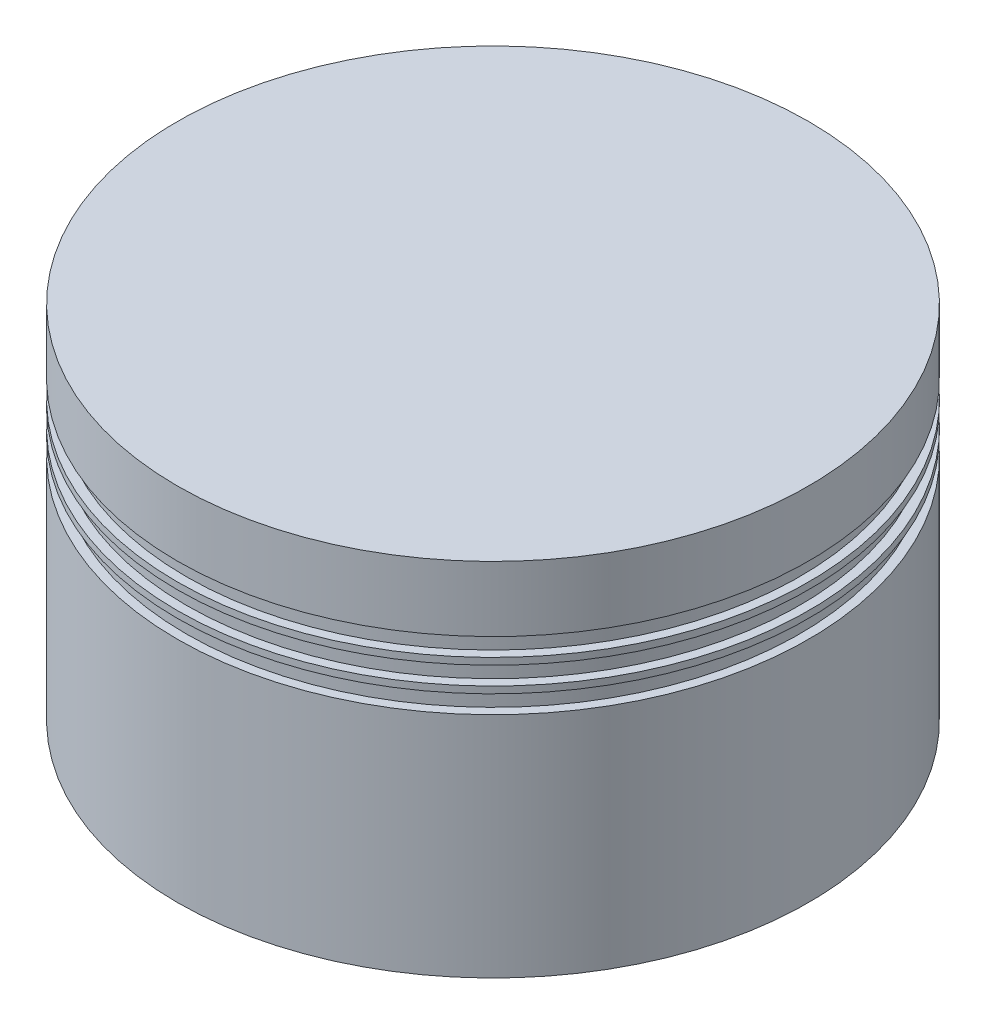
ISO-10303-21;
HEADER;
FILE_DESCRIPTION(('STEP AP214'),'2;1');
FILE_NAME('part.step','',(''),(''),'','','');
FILE_SCHEMA(('AUTOMOTIVE_DESIGN { 1 0 10303 214 1 1 1 1 }'));
ENDSEC;
DATA;
#1=APPLICATION_CONTEXT('core data for automotive mechanical design processes');
#2=APPLICATION_PROTOCOL_DEFINITION('international standard','automotive_design',2000,#1);
#3=PRODUCT_CONTEXT('',#1,'mechanical');
#4=PRODUCT('Part','Part','',(#3));
#5=PRODUCT_RELATED_PRODUCT_CATEGORY('part','',(#4));
#6=PRODUCT_DEFINITION_FORMATION('','',#4);
#7=PRODUCT_DEFINITION_CONTEXT('part definition',#1,'design');
#8=PRODUCT_DEFINITION('design','',#6,#7);
#9=PRODUCT_DEFINITION_SHAPE('','',#8);
#10=(LENGTH_UNIT() NAMED_UNIT(*) SI_UNIT(.MILLI.,.METRE.));
#11=(NAMED_UNIT(*) PLANE_ANGLE_UNIT() SI_UNIT($,.RADIAN.));
#12=(NAMED_UNIT(*) SI_UNIT($,.STERADIAN.) SOLID_ANGLE_UNIT());
#13=UNCERTAINTY_MEASURE_WITH_UNIT(LENGTH_MEASURE(1.E-05),#10,'distance_accuracy_value','');
#14=(GEOMETRIC_REPRESENTATION_CONTEXT(3) GLOBAL_UNCERTAINTY_ASSIGNED_CONTEXT((#13)) GLOBAL_UNIT_ASSIGNED_CONTEXT((#10,
#11,#12)) REPRESENTATION_CONTEXT('',''));
#15=CARTESIAN_POINT('',(0.,0.,0.));
#16=DIRECTION('',(0.,0.,1.));
#17=DIRECTION('',(1.,0.,0.));
#18=AXIS2_PLACEMENT_3D('',#15,#16,#17);
#19=CARTESIAN_POINT('',(0.,-10.,0.));
#20=DIRECTION('',(0.,1.,0.));
#21=DIRECTION('',(0.,0.,1.));
#22=AXIS2_PLACEMENT_3D('',#19,#20,#21);
#23=PLANE('',#22);
#24=CARTESIAN_POINT('',(0.,-10.,0.));
#25=DIRECTION('',(0.,1.,0.));
#26=DIRECTION('',(0.,0.,1.));
#27=AXIS2_PLACEMENT_3D('',#24,#25,#26);
#28=CIRCLE('',#27,24.);
#29=CARTESIAN_POINT('',(0.,-10.,24.));
#30=VERTEX_POINT('',#29);
#31=EDGE_CURVE('E10',#30,#30,#28,.F.);
#32=ORIENTED_EDGE('',*,*,#31,.F.);
#33=EDGE_LOOP('',(#32));
#34=FACE_BOUND('',#33,.T.);
#35=CARTESIAN_POINT('',(0.,-10.,0.));
#36=DIRECTION('',(0.,1.,0.));
#37=DIRECTION('',(0.,0.,1.));
#38=AXIS2_PLACEMENT_3D('',#35,#36,#37);
#39=CIRCLE('',#38,130.);
#40=CARTESIAN_POINT('',(0.,-10.,130.));
#41=VERTEX_POINT('',#40);
#42=EDGE_CURVE('E34',#41,#41,#39,.T.);
#43=ORIENTED_EDGE('',*,*,#42,.F.);
#44=EDGE_LOOP('',(#43));
#45=FACE_BOUND('',#44,.T.);
#46=ADVANCED_FACE('F31',(#34,#45),#23,.F.);
#47=CARTESIAN_POINT('',(0.,0.,0.));
#48=DIRECTION('',(0.,1.,0.));
#49=DIRECTION('',(0.,0.,1.));
#50=AXIS2_PLACEMENT_3D('',#47,#48,#49);
#51=CYLINDRICAL_SURFACE('',#50,130.);
#52=CARTESIAN_POINT('',(0.,-160.,0.));
#53=DIRECTION('',(0.,1.,0.));
#54=DIRECTION('',(0.,0.,1.));
#55=AXIS2_PLACEMENT_3D('',#52,#53,#54);
#56=CIRCLE('',#55,130.);
#57=CARTESIAN_POINT('',(0.,-160.,130.));
#58=VERTEX_POINT('',#57);
#59=EDGE_CURVE('E42',#58,#58,#56,.T.);
#60=ORIENTED_EDGE('',*,*,#59,.F.);
#61=EDGE_LOOP('',(#60));
#62=FACE_BOUND('',#61,.T.);
#63=ORIENTED_EDGE('',*,*,#42,.T.);
#64=EDGE_LOOP('',(#63));
#65=FACE_BOUND('',#64,.T.);
#66=ADVANCED_FACE('F93',(#62,#65),#51,.F.);
#67=CARTESIAN_POINT('',(140.,-160.,0.));
#68=DIRECTION('',(0.,1.,0.));
#69=DIRECTION('',(0.,0.,1.));
#70=AXIS2_PLACEMENT_3D('',#67,#68,#69);
#71=PLANE('',#70);
#72=CARTESIAN_POINT('',(0.,-160.,0.));
#73=DIRECTION('',(0.,1.,0.));
#74=DIRECTION('',(0.,0.,1.));
#75=AXIS2_PLACEMENT_3D('',#72,#73,#74);
#76=CIRCLE('',#75,140.);
#77=CARTESIAN_POINT('',(0.,-160.,140.));
#78=VERTEX_POINT('',#77);
#79=EDGE_CURVE('E86',#78,#78,#76,.T.);
#80=ORIENTED_EDGE('',*,*,#79,.F.);
#81=EDGE_LOOP('',(#80));
#82=FACE_BOUND('',#81,.T.);
#83=ORIENTED_EDGE('',*,*,#59,.T.);
#84=EDGE_LOOP('',(#83));
#85=FACE_BOUND('',#84,.T.);
#86=ADVANCED_FACE('F91',(#82,#85),#71,.F.);
#87=CARTESIAN_POINT('',(0.,0.,0.));
#88=DIRECTION('',(0.,1.,0.));
#89=DIRECTION('',(0.,0.,1.));
#90=AXIS2_PLACEMENT_3D('',#87,#88,#89);
#91=CYLINDRICAL_SURFACE('',#90,140.);
#92=CARTESIAN_POINT('',(0.,-58.8638032467261,0.));
#93=DIRECTION('',(0.,1.,0.));
#94=DIRECTION('',(0.,0.,1.));
#95=AXIS2_PLACEMENT_3D('',#92,#93,#94);
#96=CIRCLE('',#95,140.);
#97=CARTESIAN_POINT('',(0.,-58.8638032467261,140.));
#98=VERTEX_POINT('',#97);
#99=EDGE_CURVE('E83',#98,#98,#96,.T.);
#100=ORIENTED_EDGE('',*,*,#99,.F.);
#101=EDGE_LOOP('',(#100));
#102=FACE_BOUND('',#101,.T.);
#103=ORIENTED_EDGE('',*,*,#79,.T.);
#104=EDGE_LOOP('',(#103));
#105=FACE_BOUND('',#104,.T.);
#106=ADVANCED_FACE('F114',(#102,#105),#91,.T.);
#107=CARTESIAN_POINT('',(136.,-58.8638032467261,0.));
#108=DIRECTION('',(0.,-1.,0.));
#109=DIRECTION('',(0.,0.,-1.));
#110=AXIS2_PLACEMENT_3D('',#107,#108,#109);
#111=PLANE('',#110);
#112=CARTESIAN_POINT('',(0.,-58.8638032467261,0.));
#113=DIRECTION('',(0.,1.,0.));
#114=DIRECTION('',(0.,0.,1.));
#115=AXIS2_PLACEMENT_3D('',#112,#113,#114);
#116=CIRCLE('',#115,136.);
#117=CARTESIAN_POINT('',(0.,-58.8638032467261,136.));
#118=VERTEX_POINT('',#117);
#119=EDGE_CURVE('E80',#118,#118,#116,.T.);
#120=ORIENTED_EDGE('',*,*,#119,.F.);
#121=EDGE_LOOP('',(#120));
#122=FACE_BOUND('',#121,.T.);
#123=ORIENTED_EDGE('',*,*,#99,.T.);
#124=EDGE_LOOP('',(#123));
#125=FACE_BOUND('',#124,.T.);
#126=ADVANCED_FACE('F122',(#122,#125),#111,.F.);
#127=CARTESIAN_POINT('',(0.,0.,0.));
#128=DIRECTION('',(0.,1.,0.));
#129=DIRECTION('',(0.,0.,1.));
#130=AXIS2_PLACEMENT_3D('',#127,#128,#129);
#131=CYLINDRICAL_SURFACE('',#130,136.);
#132=CARTESIAN_POINT('',(0.,-50.8638032467261,0.));
#133=DIRECTION('',(0.,1.,0.));
#134=DIRECTION('',(0.,0.,1.));
#135=AXIS2_PLACEMENT_3D('',#132,#133,#134);
#136=CIRCLE('',#135,136.);
#137=CARTESIAN_POINT('',(0.,-50.8638032467261,136.));
#138=VERTEX_POINT('',#137);
#139=EDGE_CURVE('E77',#138,#138,#136,.T.);
#140=ORIENTED_EDGE('',*,*,#139,.F.);
#141=EDGE_LOOP('',(#140));
#142=FACE_BOUND('',#141,.T.);
#143=ORIENTED_EDGE('',*,*,#119,.T.);
#144=EDGE_LOOP('',(#143));
#145=FACE_BOUND('',#144,.T.);
#146=ADVANCED_FACE('F130',(#142,#145),#131,.T.);
#147=CARTESIAN_POINT('',(140.,-50.8638032467261,0.));
#148=DIRECTION('',(0.,1.,0.));
#149=DIRECTION('',(0.,0.,1.));
#150=AXIS2_PLACEMENT_3D('',#147,#148,#149);
#151=PLANE('',#150);
#152=CARTESIAN_POINT('',(0.,-50.8638032467261,0.));
#153=DIRECTION('',(0.,1.,0.));
#154=DIRECTION('',(0.,0.,1.));
#155=AXIS2_PLACEMENT_3D('',#152,#153,#154);
#156=CIRCLE('',#155,140.);
#157=CARTESIAN_POINT('',(0.,-50.8638032467261,140.));
#158=VERTEX_POINT('',#157);
#159=EDGE_CURVE('E74',#158,#158,#156,.T.);
#160=ORIENTED_EDGE('',*,*,#159,.F.);
#161=EDGE_LOOP('',(#160));
#162=FACE_BOUND('',#161,.T.);
#163=ORIENTED_EDGE('',*,*,#139,.T.);
#164=EDGE_LOOP('',(#163));
#165=FACE_BOUND('',#164,.T.);
#166=ADVANCED_FACE('F138',(#162,#165),#151,.F.);
#167=CARTESIAN_POINT('',(0.,0.,0.));
#168=DIRECTION('',(0.,1.,0.));
#169=DIRECTION('',(0.,0.,1.));
#170=AXIS2_PLACEMENT_3D('',#167,#168,#169);
#171=CYLINDRICAL_SURFACE('',#170,140.);
#172=CARTESIAN_POINT('',(0.,-47.8638032467261,0.));
#173=DIRECTION('',(0.,1.,0.));
#174=DIRECTION('',(0.,0.,1.));
#175=AXIS2_PLACEMENT_3D('',#172,#173,#174);
#176=CIRCLE('',#175,140.);
#177=CARTESIAN_POINT('',(0.,-47.8638032467261,140.));
#178=VERTEX_POINT('',#177);
#179=EDGE_CURVE('E71',#178,#178,#176,.T.);
#180=ORIENTED_EDGE('',*,*,#179,.F.);
#181=EDGE_LOOP('',(#180));
#182=FACE_BOUND('',#181,.T.);
#183=ORIENTED_EDGE('',*,*,#159,.T.);
#184=EDGE_LOOP('',(#183));
#185=FACE_BOUND('',#184,.T.);
#186=ADVANCED_FACE('F146',(#182,#185),#171,.T.);
#187=CARTESIAN_POINT('',(136.,-47.8638032467261,0.));
#188=DIRECTION('',(0.,-1.,0.));
#189=DIRECTION('',(0.,0.,-1.));
#190=AXIS2_PLACEMENT_3D('',#187,#188,#189);
#191=PLANE('',#190);
#192=CARTESIAN_POINT('',(0.,-47.8638032467261,0.));
#193=DIRECTION('',(0.,1.,0.));
#194=DIRECTION('',(0.,0.,1.));
#195=AXIS2_PLACEMENT_3D('',#192,#193,#194);
#196=CIRCLE('',#195,136.);
#197=CARTESIAN_POINT('',(0.,-47.8638032467261,136.));
#198=VERTEX_POINT('',#197);
#199=EDGE_CURVE('E68',#198,#198,#196,.T.);
#200=ORIENTED_EDGE('',*,*,#199,.F.);
#201=EDGE_LOOP('',(#200));
#202=FACE_BOUND('',#201,.T.);
#203=ORIENTED_EDGE('',*,*,#179,.T.);
#204=EDGE_LOOP('',(#203));
#205=FACE_BOUND('',#204,.T.);
#206=ADVANCED_FACE('F154',(#202,#205),#191,.F.);
#207=CARTESIAN_POINT('',(0.,0.,0.));
#208=DIRECTION('',(0.,1.,0.));
#209=DIRECTION('',(0.,0.,1.));
#210=AXIS2_PLACEMENT_3D('',#207,#208,#209);
#211=CYLINDRICAL_SURFACE('',#210,136.);
#212=CARTESIAN_POINT('',(0.,-39.8638032467261,0.));
#213=DIRECTION('',(0.,1.,0.));
#214=DIRECTION('',(0.,0.,1.));
#215=AXIS2_PLACEMENT_3D('',#212,#213,#214);
#216=CIRCLE('',#215,136.);
#217=CARTESIAN_POINT('',(0.,-39.8638032467261,136.));
#218=VERTEX_POINT('',#217);
#219=EDGE_CURVE('E65',#218,#218,#216,.T.);
#220=ORIENTED_EDGE('',*,*,#219,.F.);
#221=EDGE_LOOP('',(#220));
#222=FACE_BOUND('',#221,.T.);
#223=ORIENTED_EDGE('',*,*,#199,.T.);
#224=EDGE_LOOP('',(#223));
#225=FACE_BOUND('',#224,.T.);
#226=ADVANCED_FACE('F162',(#222,#225),#211,.T.);
#227=CARTESIAN_POINT('',(140.,-39.8638032467261,0.));
#228=DIRECTION('',(0.,1.,0.));
#229=DIRECTION('',(0.,0.,1.));
#230=AXIS2_PLACEMENT_3D('',#227,#228,#229);
#231=PLANE('',#230);
#232=CARTESIAN_POINT('',(0.,-39.8638032467261,0.));
#233=DIRECTION('',(0.,1.,0.));
#234=DIRECTION('',(0.,0.,1.));
#235=AXIS2_PLACEMENT_3D('',#232,#233,#234);
#236=CIRCLE('',#235,140.);
#237=CARTESIAN_POINT('',(0.,-39.8638032467261,140.));
#238=VERTEX_POINT('',#237);
#239=EDGE_CURVE('E62',#238,#238,#236,.T.);
#240=ORIENTED_EDGE('',*,*,#239,.F.);
#241=EDGE_LOOP('',(#240));
#242=FACE_BOUND('',#241,.T.);
#243=ORIENTED_EDGE('',*,*,#219,.T.);
#244=EDGE_LOOP('',(#243));
#245=FACE_BOUND('',#244,.T.);
#246=ADVANCED_FACE('F170',(#242,#245),#231,.F.);
#247=CARTESIAN_POINT('',(0.,0.,0.));
#248=DIRECTION('',(0.,1.,0.));
#249=DIRECTION('',(0.,0.,1.));
#250=AXIS2_PLACEMENT_3D('',#247,#248,#249);
#251=CYLINDRICAL_SURFACE('',#250,140.);
#252=CARTESIAN_POINT('',(0.,-36.8638032467261,0.));
#253=DIRECTION('',(0.,1.,0.));
#254=DIRECTION('',(0.,0.,1.));
#255=AXIS2_PLACEMENT_3D('',#252,#253,#254);
#256=CIRCLE('',#255,140.);
#257=CARTESIAN_POINT('',(0.,-36.8638032467261,140.));
#258=VERTEX_POINT('',#257);
#259=EDGE_CURVE('E59',#258,#258,#256,.T.);
#260=ORIENTED_EDGE('',*,*,#259,.F.);
#261=EDGE_LOOP('',(#260));
#262=FACE_BOUND('',#261,.T.);
#263=ORIENTED_EDGE('',*,*,#239,.T.);
#264=EDGE_LOOP('',(#263));
#265=FACE_BOUND('',#264,.T.);
#266=ADVANCED_FACE('F178',(#262,#265),#251,.T.);
#267=CARTESIAN_POINT('',(136.,-36.8638032467261,0.));
#268=DIRECTION('',(0.,-1.,0.));
#269=DIRECTION('',(0.,0.,-1.));
#270=AXIS2_PLACEMENT_3D('',#267,#268,#269);
#271=PLANE('',#270);
#272=CARTESIAN_POINT('',(0.,-36.8638032467261,0.));
#273=DIRECTION('',(0.,1.,0.));
#274=DIRECTION('',(0.,0.,1.));
#275=AXIS2_PLACEMENT_3D('',#272,#273,#274);
#276=CIRCLE('',#275,136.);
#277=CARTESIAN_POINT('',(0.,-36.8638032467261,136.));
#278=VERTEX_POINT('',#277);
#279=EDGE_CURVE('E56',#278,#278,#276,.T.);
#280=ORIENTED_EDGE('',*,*,#279,.F.);
#281=EDGE_LOOP('',(#280));
#282=FACE_BOUND('',#281,.T.);
#283=ORIENTED_EDGE('',*,*,#259,.T.);
#284=EDGE_LOOP('',(#283));
#285=FACE_BOUND('',#284,.T.);
#286=ADVANCED_FACE('F186',(#282,#285),#271,.F.);
#287=CARTESIAN_POINT('',(0.,0.,0.));
#288=DIRECTION('',(0.,1.,0.));
#289=DIRECTION('',(0.,0.,1.));
#290=AXIS2_PLACEMENT_3D('',#287,#288,#289);
#291=CYLINDRICAL_SURFACE('',#290,136.);
#292=CARTESIAN_POINT('',(0.,-28.8638032467261,0.));
#293=DIRECTION('',(0.,1.,0.));
#294=DIRECTION('',(0.,0.,1.));
#295=AXIS2_PLACEMENT_3D('',#292,#293,#294);
#296=CIRCLE('',#295,136.);
#297=CARTESIAN_POINT('',(0.,-28.8638032467261,136.));
#298=VERTEX_POINT('',#297);
#299=EDGE_CURVE('E53',#298,#298,#296,.T.);
#300=ORIENTED_EDGE('',*,*,#299,.F.);
#301=EDGE_LOOP('',(#300));
#302=FACE_BOUND('',#301,.T.);
#303=ORIENTED_EDGE('',*,*,#279,.T.);
#304=EDGE_LOOP('',(#303));
#305=FACE_BOUND('',#304,.T.);
#306=ADVANCED_FACE('F194',(#302,#305),#291,.T.);
#307=CARTESIAN_POINT('',(140.,-28.8638032467261,0.));
#308=DIRECTION('',(0.,1.,0.));
#309=DIRECTION('',(0.,0.,1.));
#310=AXIS2_PLACEMENT_3D('',#307,#308,#309);
#311=PLANE('',#310);
#312=CARTESIAN_POINT('',(0.,-28.8638032467261,0.));
#313=DIRECTION('',(0.,1.,0.));
#314=DIRECTION('',(0.,0.,1.));
#315=AXIS2_PLACEMENT_3D('',#312,#313,#314);
#316=CIRCLE('',#315,140.);
#317=CARTESIAN_POINT('',(0.,-28.8638032467261,140.));
#318=VERTEX_POINT('',#317);
#319=EDGE_CURVE('E50',#318,#318,#316,.T.);
#320=ORIENTED_EDGE('',*,*,#319,.F.);
#321=EDGE_LOOP('',(#320));
#322=FACE_BOUND('',#321,.T.);
#323=ORIENTED_EDGE('',*,*,#299,.T.);
#324=EDGE_LOOP('',(#323));
#325=FACE_BOUND('',#324,.T.);
#326=ADVANCED_FACE('F202',(#322,#325),#311,.F.);
#327=CARTESIAN_POINT('',(0.,0.,0.));
#328=DIRECTION('',(0.,1.,0.));
#329=DIRECTION('',(0.,0.,1.));
#330=AXIS2_PLACEMENT_3D('',#327,#328,#329);
#331=CYLINDRICAL_SURFACE('',#330,140.);
#332=CARTESIAN_POINT('',(0.,0.,0.));
#333=DIRECTION('',(0.,1.,0.));
#334=DIRECTION('',(0.,0.,1.));
#335=AXIS2_PLACEMENT_3D('',#332,#333,#334);
#336=CIRCLE('',#335,140.);
#337=CARTESIAN_POINT('',(0.,0.,140.));
#338=VERTEX_POINT('',#337);
#339=EDGE_CURVE('E47',#338,#338,#336,.T.);
#340=ORIENTED_EDGE('',*,*,#339,.F.);
#341=EDGE_LOOP('',(#340));
#342=FACE_BOUND('',#341,.T.);
#343=ORIENTED_EDGE('',*,*,#319,.T.);
#344=EDGE_LOOP('',(#343));
#345=FACE_BOUND('',#344,.T.);
#346=ADVANCED_FACE('F210',(#342,#345),#331,.T.);
#347=CARTESIAN_POINT('',(0.,0.,0.));
#348=DIRECTION('',(0.,-1.,0.));
#349=DIRECTION('',(0.,0.,-1.));
#350=AXIS2_PLACEMENT_3D('',#347,#348,#349);
#351=PLANE('',#350);
#352=ORIENTED_EDGE('',*,*,#339,.T.);
#353=EDGE_LOOP('',(#352));
#354=FACE_BOUND('',#353,.T.);
#355=ADVANCED_FACE('F217',(#354),#351,.F.);
#356=CARTESIAN_POINT('',(0.,0.,0.));
#357=DIRECTION('',(0.,1.,0.));
#358=DIRECTION('',(-1.,0.,0.));
#359=AXIS2_PLACEMENT_3D('',#356,#357,#358);
#360=CYLINDRICAL_SURFACE('',#359,24.);
#361=CARTESIAN_POINT('',(0.,-150.,0.));
#362=DIRECTION('',(0.,1.,0.));
#363=DIRECTION('',(-1.,0.,0.));
#364=AXIS2_PLACEMENT_3D('',#361,#362,#363);
#365=CIRCLE('',#364,24.);
#366=CARTESIAN_POINT('',(-24.,-150.,0.));
#367=VERTEX_POINT('',#366);
#368=EDGE_CURVE('E45',#367,#367,#365,.T.);
#369=ORIENTED_EDGE('',*,*,#368,.T.);
#370=EDGE_LOOP('',(#369));
#371=FACE_BOUND('',#370,.T.);
#372=ORIENTED_EDGE('',*,*,#31,.T.);
#373=EDGE_LOOP('',(#372));
#374=FACE_BOUND('',#373,.T.);
#375=ADVANCED_FACE('F224',(#371,#374),#360,.T.);
#376=CARTESIAN_POINT('',(24.,-150.,0.));
#377=DIRECTION('',(0.,1.,0.));
#378=DIRECTION('',(-1.,0.,0.));
#379=AXIS2_PLACEMENT_3D('',#376,#377,#378);
#380=PLANE('',#379);
#381=ORIENTED_EDGE('',*,*,#368,.F.);
#382=EDGE_LOOP('',(#381));
#383=FACE_BOUND('',#382,.T.);
#384=CARTESIAN_POINT('',(0.,-150.,0.));
#385=DIRECTION('',(0.,1.,0.));
#386=DIRECTION('',(-1.,0.,0.));
#387=AXIS2_PLACEMENT_3D('',#384,#385,#386);
#388=CIRCLE('',#387,9.99999999999999);
#389=CARTESIAN_POINT('',(-9.99999999999997,-150.,0.));
#390=VERTEX_POINT('',#389);
#391=EDGE_CURVE('E293',#390,#390,#388,.T.);
#392=ORIENTED_EDGE('',*,*,#391,.T.);
#393=EDGE_LOOP('',(#392));
#394=FACE_BOUND('',#393,.T.);
#395=ADVANCED_FACE('F232',(#383,#394),#380,.F.);
#396=CARTESIAN_POINT('',(0.,-150.,0.));
#397=DIRECTION('',(0.,1.,0.));
#398=DIRECTION('',(1.,0.,0.));
#399=AXIS2_PLACEMENT_3D('',#396,#397,#398);
#400=SPHERICAL_SURFACE('',#399,9.99999999999999);
#401=ORIENTED_EDGE('',*,*,#391,.F.);
#402=EDGE_LOOP('',(#401));
#403=FACE_BOUND('',#402,.T.);
#404=ADVANCED_FACE('F240',(#403),#400,.F.);
#405=CLOSED_SHELL('',(#46,#66,#86,#106,#126,#146,#166,#186,#206,#226,#246,#266,#286,#306,#326,
#346,#355,#375,#395,#404));
#406=MANIFOLD_SOLID_BREP('B2',#405);
#407=ADVANCED_BREP_SHAPE_REPRESENTATION('',(#18,#406),#14);
#408=SHAPE_DEFINITION_REPRESENTATION(#9,#407);
ENDSEC;
END-ISO-10303-21;
